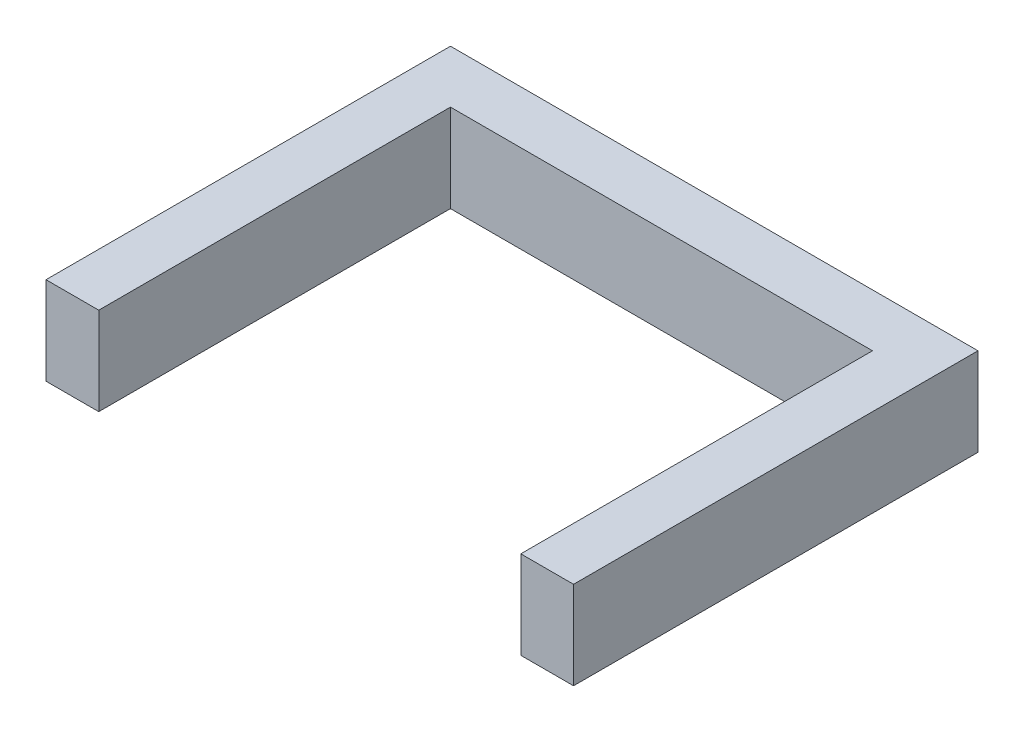
ISO-10303-21;
HEADER;
FILE_DESCRIPTION(('STEP AP214'),'2;1');
FILE_NAME('part.step','',(''),(''),'','','');
FILE_SCHEMA(('AUTOMOTIVE_DESIGN { 1 0 10303 214 1 1 1 1 }'));
ENDSEC;
DATA;
#1=APPLICATION_CONTEXT('core data for automotive mechanical design processes');
#2=APPLICATION_PROTOCOL_DEFINITION('international standard','automotive_design',2000,#1);
#3=PRODUCT_CONTEXT('',#1,'mechanical');
#4=PRODUCT('Part','Part','',(#3));
#5=PRODUCT_RELATED_PRODUCT_CATEGORY('part','',(#4));
#6=PRODUCT_DEFINITION_FORMATION('','',#4);
#7=PRODUCT_DEFINITION_CONTEXT('part definition',#1,'design');
#8=PRODUCT_DEFINITION('design','',#6,#7);
#9=PRODUCT_DEFINITION_SHAPE('','',#8);
#10=(LENGTH_UNIT() NAMED_UNIT(*) SI_UNIT(.MILLI.,.METRE.));
#11=(NAMED_UNIT(*) PLANE_ANGLE_UNIT() SI_UNIT($,.RADIAN.));
#12=(NAMED_UNIT(*) SI_UNIT($,.STERADIAN.) SOLID_ANGLE_UNIT());
#13=UNCERTAINTY_MEASURE_WITH_UNIT(LENGTH_MEASURE(1.E-05),#10,'distance_accuracy_value','');
#14=(GEOMETRIC_REPRESENTATION_CONTEXT(3) GLOBAL_UNCERTAINTY_ASSIGNED_CONTEXT((#13)) GLOBAL_UNIT_ASSIGNED_CONTEXT((#10,
#11,#12)) REPRESENTATION_CONTEXT('',''));
#15=CARTESIAN_POINT('',(0.,0.,0.));
#16=DIRECTION('',(0.,0.,1.));
#17=DIRECTION('',(1.,0.,0.));
#18=AXIS2_PLACEMENT_3D('',#15,#16,#17);
#19=CARTESIAN_POINT('',(-15.,5.,20.));
#20=DIRECTION('',(1.,0.,0.));
#21=DIRECTION('',(0.,0.,-1.));
#22=AXIS2_PLACEMENT_3D('',#19,#20,#21);
#23=PLANE('',#22);
#24=DIRECTION('',(0.,0.,1.));
#25=VECTOR('',#24,1.);
#26=CARTESIAN_POINT('',(-15.,0.,20.));
#27=LINE('',#26,#25);
#28=CARTESIAN_POINT('',(-15.,0.,-3.));
#29=VERTEX_POINT('',#28);
#30=CARTESIAN_POINT('',(-15.,0.,20.));
#31=VERTEX_POINT('',#30);
#32=EDGE_CURVE('E140',#29,#31,#27,.T.);
#33=ORIENTED_EDGE('',*,*,#32,.T.);
#34=DIRECTION('',(0.,-1.,0.));
#35=VECTOR('',#34,1.);
#36=CARTESIAN_POINT('',(-15.,5.,20.));
#37=LINE('',#36,#35);
#38=CARTESIAN_POINT('',(-15.,5.,20.));
#39=VERTEX_POINT('',#38);
#40=EDGE_CURVE('E11',#39,#31,#37,.T.);
#41=ORIENTED_EDGE('',*,*,#40,.F.);
#42=DIRECTION('',(0.,0.,1.));
#43=VECTOR('',#42,1.);
#44=CARTESIAN_POINT('',(-15.,5.,20.));
#45=LINE('',#44,#43);
#46=CARTESIAN_POINT('',(-15.,5.,-3.));
#47=VERTEX_POINT('',#46);
#48=EDGE_CURVE('E162',#47,#39,#45,.T.);
#49=ORIENTED_EDGE('',*,*,#48,.F.);
#50=DIRECTION('',(0.,-1.,0.));
#51=VECTOR('',#50,1.);
#52=CARTESIAN_POINT('',(-15.,5.,-3.));
#53=LINE('',#52,#51);
#54=EDGE_CURVE('E136',#47,#29,#53,.T.);
#55=ORIENTED_EDGE('',*,*,#54,.T.);
#56=EDGE_LOOP('',(#33,#41,#49,#55));
#57=FACE_BOUND('',#56,.T.);
#58=ADVANCED_FACE('F39',(#57),#23,.F.);
#59=CARTESIAN_POINT('',(-12.,5.,20.));
#60=DIRECTION('',(0.,0.,-1.));
#61=DIRECTION('',(-1.,0.,0.));
#62=AXIS2_PLACEMENT_3D('',#59,#60,#61);
#63=PLANE('',#62);
#64=DIRECTION('',(1.,0.,0.));
#65=VECTOR('',#64,1.);
#66=CARTESIAN_POINT('',(-12.,0.,20.));
#67=LINE('',#66,#65);
#68=CARTESIAN_POINT('',(-12.,0.,20.));
#69=VERTEX_POINT('',#68);
#70=EDGE_CURVE('E144',#31,#69,#67,.T.);
#71=ORIENTED_EDGE('',*,*,#70,.T.);
#72=DIRECTION('',(0.,-1.,0.));
#73=VECTOR('',#72,1.);
#74=CARTESIAN_POINT('',(-12.,5.,20.));
#75=LINE('',#74,#73);
#76=CARTESIAN_POINT('',(-12.,5.,20.));
#77=VERTEX_POINT('',#76);
#78=EDGE_CURVE('E48',#77,#69,#75,.T.);
#79=ORIENTED_EDGE('',*,*,#78,.F.);
#80=DIRECTION('',(1.,0.,0.));
#81=VECTOR('',#80,1.);
#82=CARTESIAN_POINT('',(-12.,5.,20.));
#83=LINE('',#82,#81);
#84=EDGE_CURVE('E99',#39,#77,#83,.T.);
#85=ORIENTED_EDGE('',*,*,#84,.F.);
#86=ORIENTED_EDGE('',*,*,#40,.T.);
#87=EDGE_LOOP('',(#71,#79,#85,#86));
#88=FACE_BOUND('',#87,.T.);
#89=ADVANCED_FACE('F208',(#88),#63,.F.);
#90=CARTESIAN_POINT('',(-12.,5.,0.));
#91=DIRECTION('',(-1.,0.,0.));
#92=DIRECTION('',(0.,0.,1.));
#93=AXIS2_PLACEMENT_3D('',#90,#91,#92);
#94=PLANE('',#93);
#95=DIRECTION('',(0.,0.,-1.));
#96=VECTOR('',#95,1.);
#97=CARTESIAN_POINT('',(-12.,0.,0.));
#98=LINE('',#97,#96);
#99=CARTESIAN_POINT('',(-12.,0.,0.));
#100=VERTEX_POINT('',#99);
#101=EDGE_CURVE('E147',#69,#100,#98,.T.);
#102=ORIENTED_EDGE('',*,*,#101,.T.);
#103=DIRECTION('',(0.,-1.,0.));
#104=VECTOR('',#103,1.);
#105=CARTESIAN_POINT('',(-12.,5.,0.));
#106=LINE('',#105,#104);
#107=CARTESIAN_POINT('',(-12.,5.,0.));
#108=VERTEX_POINT('',#107);
#109=EDGE_CURVE('E173',#108,#100,#106,.T.);
#110=ORIENTED_EDGE('',*,*,#109,.F.);
#111=DIRECTION('',(0.,0.,-1.));
#112=VECTOR('',#111,1.);
#113=CARTESIAN_POINT('',(-12.,5.,0.));
#114=LINE('',#113,#112);
#115=EDGE_CURVE('E183',#77,#108,#114,.T.);
#116=ORIENTED_EDGE('',*,*,#115,.F.);
#117=ORIENTED_EDGE('',*,*,#78,.T.);
#118=EDGE_LOOP('',(#102,#110,#116,#117));
#119=FACE_BOUND('',#118,.T.);
#120=ADVANCED_FACE('F181',(#119),#94,.F.);
#121=CARTESIAN_POINT('',(12.,5.,0.));
#122=DIRECTION('',(0.,0.,-1.));
#123=DIRECTION('',(-1.,0.,0.));
#124=AXIS2_PLACEMENT_3D('',#121,#122,#123);
#125=PLANE('',#124);
#126=DIRECTION('',(1.,0.,0.));
#127=VECTOR('',#126,1.);
#128=CARTESIAN_POINT('',(12.,0.,0.));
#129=LINE('',#128,#127);
#130=CARTESIAN_POINT('',(12.,0.,0.));
#131=VERTEX_POINT('',#130);
#132=EDGE_CURVE('E150',#100,#131,#129,.T.);
#133=ORIENTED_EDGE('',*,*,#132,.T.);
#134=DIRECTION('',(0.,-1.,0.));
#135=VECTOR('',#134,1.);
#136=CARTESIAN_POINT('',(12.,5.,0.));
#137=LINE('',#136,#135);
#138=CARTESIAN_POINT('',(12.,5.,0.));
#139=VERTEX_POINT('',#138);
#140=EDGE_CURVE('E169',#139,#131,#137,.T.);
#141=ORIENTED_EDGE('',*,*,#140,.F.);
#142=DIRECTION('',(1.,0.,0.));
#143=VECTOR('',#142,1.);
#144=CARTESIAN_POINT('',(12.,5.,0.));
#145=LINE('',#144,#143);
#146=EDGE_CURVE('E196',#108,#139,#145,.T.);
#147=ORIENTED_EDGE('',*,*,#146,.F.);
#148=ORIENTED_EDGE('',*,*,#109,.T.);
#149=EDGE_LOOP('',(#133,#141,#147,#148));
#150=FACE_BOUND('',#149,.T.);
#151=ADVANCED_FACE('F191',(#150),#125,.F.);
#152=CARTESIAN_POINT('',(12.,5.,20.));
#153=DIRECTION('',(1.,0.,0.));
#154=DIRECTION('',(0.,0.,-1.));
#155=AXIS2_PLACEMENT_3D('',#152,#153,#154);
#156=PLANE('',#155);
#157=DIRECTION('',(0.,0.,1.));
#158=VECTOR('',#157,1.);
#159=CARTESIAN_POINT('',(12.,0.,20.));
#160=LINE('',#159,#158);
#161=CARTESIAN_POINT('',(12.,0.,20.));
#162=VERTEX_POINT('',#161);
#163=EDGE_CURVE('E153',#131,#162,#160,.T.);
#164=ORIENTED_EDGE('',*,*,#163,.T.);
#165=DIRECTION('',(0.,-1.,0.));
#166=VECTOR('',#165,1.);
#167=CARTESIAN_POINT('',(12.,5.,20.));
#168=LINE('',#167,#166);
#169=CARTESIAN_POINT('',(12.,5.,20.));
#170=VERTEX_POINT('',#169);
#171=EDGE_CURVE('E129',#170,#162,#168,.T.);
#172=ORIENTED_EDGE('',*,*,#171,.F.);
#173=DIRECTION('',(0.,0.,1.));
#174=VECTOR('',#173,1.);
#175=CARTESIAN_POINT('',(12.,5.,20.));
#176=LINE('',#175,#174);
#177=EDGE_CURVE('E118',#139,#170,#176,.T.);
#178=ORIENTED_EDGE('',*,*,#177,.F.);
#179=ORIENTED_EDGE('',*,*,#140,.T.);
#180=EDGE_LOOP('',(#164,#172,#178,#179));
#181=FACE_BOUND('',#180,.T.);
#182=ADVANCED_FACE('F194',(#181),#156,.F.);
#183=CARTESIAN_POINT('',(15.,5.,20.));
#184=DIRECTION('',(0.,0.,-1.));
#185=DIRECTION('',(-1.,0.,0.));
#186=AXIS2_PLACEMENT_3D('',#183,#184,#185);
#187=PLANE('',#186);
#188=DIRECTION('',(1.,0.,0.));
#189=VECTOR('',#188,1.);
#190=CARTESIAN_POINT('',(15.,0.,20.));
#191=LINE('',#190,#189);
#192=CARTESIAN_POINT('',(15.,0.,20.));
#193=VERTEX_POINT('',#192);
#194=EDGE_CURVE('E127',#162,#193,#191,.T.);
#195=ORIENTED_EDGE('',*,*,#194,.T.);
#196=DIRECTION('',(0.,-1.,0.));
#197=VECTOR('',#196,1.);
#198=CARTESIAN_POINT('',(15.,5.,20.));
#199=LINE('',#198,#197);
#200=CARTESIAN_POINT('',(15.,5.,20.));
#201=VERTEX_POINT('',#200);
#202=EDGE_CURVE('E124',#201,#193,#199,.T.);
#203=ORIENTED_EDGE('',*,*,#202,.F.);
#204=DIRECTION('',(1.,0.,0.));
#205=VECTOR('',#204,1.);
#206=CARTESIAN_POINT('',(15.,5.,20.));
#207=LINE('',#206,#205);
#208=EDGE_CURVE('E112',#170,#201,#207,.T.);
#209=ORIENTED_EDGE('',*,*,#208,.F.);
#210=ORIENTED_EDGE('',*,*,#171,.T.);
#211=EDGE_LOOP('',(#195,#203,#209,#210));
#212=FACE_BOUND('',#211,.T.);
#213=ADVANCED_FACE('F125',(#212),#187,.F.);
#214=CARTESIAN_POINT('',(15.,5.,-3.));
#215=DIRECTION('',(-1.,0.,0.));
#216=DIRECTION('',(0.,0.,1.));
#217=AXIS2_PLACEMENT_3D('',#214,#215,#216);
#218=PLANE('',#217);
#219=DIRECTION('',(0.,0.,-1.));
#220=VECTOR('',#219,1.);
#221=CARTESIAN_POINT('',(15.,0.,-3.));
#222=LINE('',#221,#220);
#223=CARTESIAN_POINT('',(15.,0.,-3.));
#224=VERTEX_POINT('',#223);
#225=EDGE_CURVE('E85',#193,#224,#222,.T.);
#226=ORIENTED_EDGE('',*,*,#225,.T.);
#227=DIRECTION('',(0.,-1.,0.));
#228=VECTOR('',#227,1.);
#229=CARTESIAN_POINT('',(15.,5.,-3.));
#230=LINE('',#229,#228);
#231=CARTESIAN_POINT('',(15.,5.,-3.));
#232=VERTEX_POINT('',#231);
#233=EDGE_CURVE('E130',#232,#224,#230,.T.);
#234=ORIENTED_EDGE('',*,*,#233,.F.);
#235=DIRECTION('',(0.,0.,-1.));
#236=VECTOR('',#235,1.);
#237=CARTESIAN_POINT('',(15.,5.,-3.));
#238=LINE('',#237,#236);
#239=EDGE_CURVE('E116',#201,#232,#238,.T.);
#240=ORIENTED_EDGE('',*,*,#239,.F.);
#241=ORIENTED_EDGE('',*,*,#202,.T.);
#242=EDGE_LOOP('',(#226,#234,#240,#241));
#243=FACE_BOUND('',#242,.T.);
#244=ADVANCED_FACE('F132',(#243),#218,.F.);
#245=CARTESIAN_POINT('',(-15.,5.,-3.));
#246=DIRECTION('',(0.,0.,1.));
#247=DIRECTION('',(1.,0.,0.));
#248=AXIS2_PLACEMENT_3D('',#245,#246,#247);
#249=PLANE('',#248);
#250=DIRECTION('',(-1.,0.,0.));
#251=VECTOR('',#250,1.);
#252=CARTESIAN_POINT('',(-15.,0.,-3.));
#253=LINE('',#252,#251);
#254=EDGE_CURVE('E91',#224,#29,#253,.T.);
#255=ORIENTED_EDGE('',*,*,#254,.T.);
#256=ORIENTED_EDGE('',*,*,#54,.F.);
#257=DIRECTION('',(-1.,0.,0.));
#258=VECTOR('',#257,1.);
#259=CARTESIAN_POINT('',(-15.,5.,-3.));
#260=LINE('',#259,#258);
#261=EDGE_CURVE('E56',#232,#47,#260,.T.);
#262=ORIENTED_EDGE('',*,*,#261,.F.);
#263=ORIENTED_EDGE('',*,*,#233,.T.);
#264=EDGE_LOOP('',(#255,#256,#262,#263));
#265=FACE_BOUND('',#264,.T.);
#266=ADVANCED_FACE('F224',(#265),#249,.F.);
#267=CARTESIAN_POINT('',(0.,5.,0.));
#268=DIRECTION('',(0.,-1.,0.));
#269=DIRECTION('',(0.,0.,-1.));
#270=AXIS2_PLACEMENT_3D('',#267,#268,#269);
#271=PLANE('',#270);
#272=ORIENTED_EDGE('',*,*,#48,.T.);
#273=ORIENTED_EDGE('',*,*,#84,.T.);
#274=ORIENTED_EDGE('',*,*,#115,.T.);
#275=ORIENTED_EDGE('',*,*,#146,.T.);
#276=ORIENTED_EDGE('',*,*,#177,.T.);
#277=ORIENTED_EDGE('',*,*,#208,.T.);
#278=ORIENTED_EDGE('',*,*,#239,.T.);
#279=ORIENTED_EDGE('',*,*,#261,.T.);
#280=EDGE_LOOP('',(#272,#273,#274,#275,#276,#277,#278,#279));
#281=FACE_BOUND('',#280,.T.);
#282=ADVANCED_FACE('F114',(#281),#271,.F.);
#283=CARTESIAN_POINT('',(0.,0.,0.));
#284=DIRECTION('',(0.,-1.,0.));
#285=DIRECTION('',(0.,0.,-1.));
#286=AXIS2_PLACEMENT_3D('',#283,#284,#285);
#287=PLANE('',#286);
#288=ORIENTED_EDGE('',*,*,#32,.F.);
#289=ORIENTED_EDGE('',*,*,#254,.F.);
#290=ORIENTED_EDGE('',*,*,#225,.F.);
#291=ORIENTED_EDGE('',*,*,#194,.F.);
#292=ORIENTED_EDGE('',*,*,#163,.F.);
#293=ORIENTED_EDGE('',*,*,#132,.F.);
#294=ORIENTED_EDGE('',*,*,#101,.F.);
#295=ORIENTED_EDGE('',*,*,#70,.F.);
#296=EDGE_LOOP('',(#288,#289,#290,#291,#292,#293,#294,#295));
#297=FACE_BOUND('',#296,.T.);
#298=ADVANCED_FACE('F187',(#297),#287,.T.);
#299=CLOSED_SHELL('',(#58,#89,#120,#151,#182,#213,#244,#266,#282,#298));
#300=MANIFOLD_SOLID_BREP('B2',#299);
#301=ADVANCED_BREP_SHAPE_REPRESENTATION('',(#18,#300),#14);
#302=SHAPE_DEFINITION_REPRESENTATION(#9,#301);
ENDSEC;
END-ISO-10303-21;
